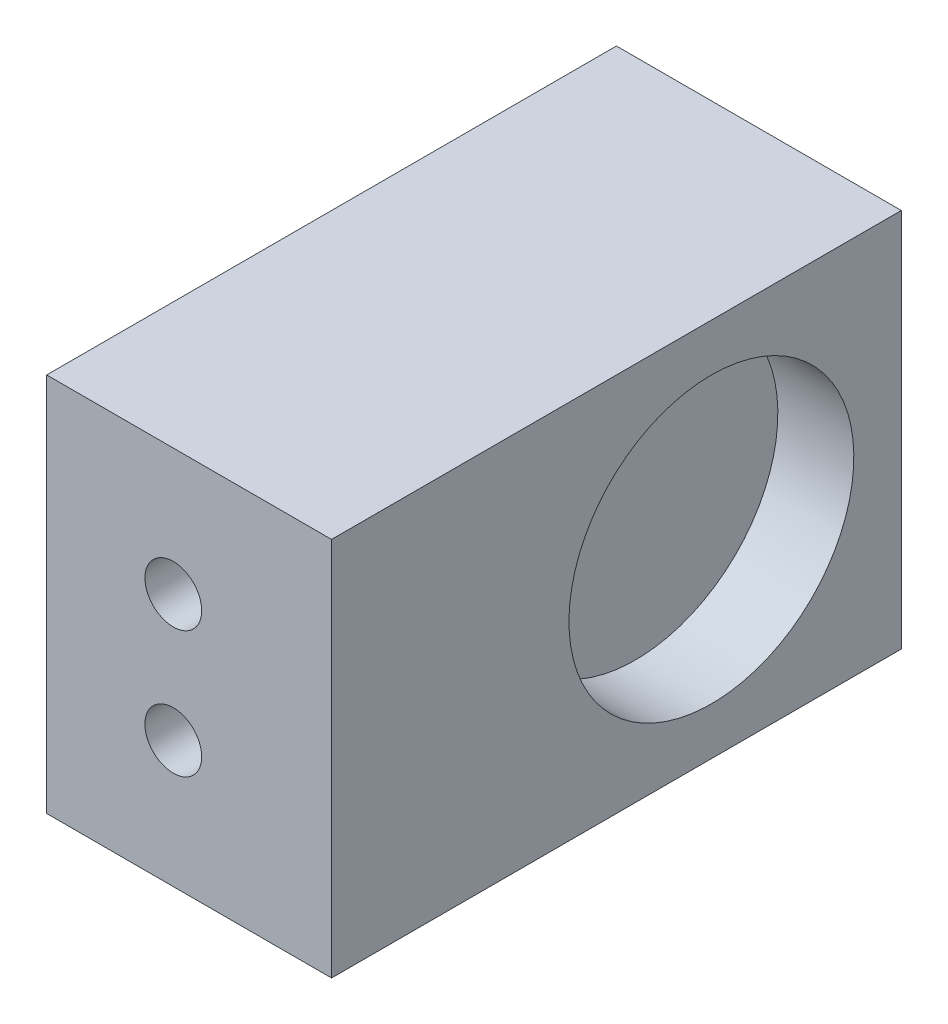
ISO-10303-21;
HEADER;
FILE_DESCRIPTION(('STEP AP214'),'2;1');
FILE_NAME('part.step','',(''),(''),'','','');
FILE_SCHEMA(('AUTOMOTIVE_DESIGN { 1 0 10303 214 1 1 1 1 }'));
ENDSEC;
DATA;
#1=APPLICATION_CONTEXT('core data for automotive mechanical design processes');
#2=APPLICATION_PROTOCOL_DEFINITION('international standard','automotive_design',2000,#1);
#3=PRODUCT_CONTEXT('',#1,'mechanical');
#4=PRODUCT('Part','Part','',(#3));
#5=PRODUCT_RELATED_PRODUCT_CATEGORY('part','',(#4));
#6=PRODUCT_DEFINITION_FORMATION('','',#4);
#7=PRODUCT_DEFINITION_CONTEXT('part definition',#1,'design');
#8=PRODUCT_DEFINITION('design','',#6,#7);
#9=PRODUCT_DEFINITION_SHAPE('','',#8);
#10=(LENGTH_UNIT() NAMED_UNIT(*) SI_UNIT(.MILLI.,.METRE.));
#11=(NAMED_UNIT(*) PLANE_ANGLE_UNIT() SI_UNIT($,.RADIAN.));
#12=(NAMED_UNIT(*) SI_UNIT($,.STERADIAN.) SOLID_ANGLE_UNIT());
#13=UNCERTAINTY_MEASURE_WITH_UNIT(LENGTH_MEASURE(1.E-05),#10,'distance_accuracy_value','');
#14=(GEOMETRIC_REPRESENTATION_CONTEXT(3) GLOBAL_UNCERTAINTY_ASSIGNED_CONTEXT((#13)) GLOBAL_UNIT_ASSIGNED_CONTEXT((#10,
#11,#12)) REPRESENTATION_CONTEXT('',''));
#15=CARTESIAN_POINT('',(0.,0.,0.));
#16=DIRECTION('',(0.,0.,1.));
#17=DIRECTION('',(1.,0.,0.));
#18=AXIS2_PLACEMENT_3D('',#15,#16,#17);
#19=CARTESIAN_POINT('',(0.,0.,38.1));
#20=DIRECTION('',(-1.,0.,0.));
#21=DIRECTION('',(0.,-1.,0.));
#22=AXIS2_PLACEMENT_3D('',#19,#20,#21);
#23=PLANE('',#22);
#24=CARTESIAN_POINT('',(0.,12.7,12.7));
#25=DIRECTION('',(1.,0.,0.));
#26=DIRECTION('',(0.,1.,0.));
#27=AXIS2_PLACEMENT_3D('',#24,#25,#26);
#28=CIRCLE('',#27,9.525);
#29=CARTESIAN_POINT('',(0.,22.225,12.7));
#30=VERTEX_POINT('',#29);
#31=EDGE_CURVE('E176',#30,#30,#28,.T.);
#32=ORIENTED_EDGE('',*,*,#31,.F.);
#33=EDGE_LOOP('',(#32));
#34=FACE_BOUND('',#33,.T.);
#35=DIRECTION('',(0.,1.,0.));
#36=VECTOR('',#35,1.);
#37=CARTESIAN_POINT('',(0.,0.,0.));
#38=LINE('',#37,#36);
#39=CARTESIAN_POINT('',(0.,0.,0.));
#40=VERTEX_POINT('',#39);
#41=CARTESIAN_POINT('',(0.,25.4,0.));
#42=VERTEX_POINT('',#41);
#43=EDGE_CURVE('E121',#40,#42,#38,.T.);
#44=ORIENTED_EDGE('',*,*,#43,.T.);
#45=DIRECTION('',(0.,0.,-1.));
#46=VECTOR('',#45,1.);
#47=CARTESIAN_POINT('',(0.,25.4,38.1));
#48=LINE('',#47,#46);
#49=CARTESIAN_POINT('',(0.,25.4,38.1));
#50=VERTEX_POINT('',#49);
#51=EDGE_CURVE('E11',#50,#42,#48,.T.);
#52=ORIENTED_EDGE('',*,*,#51,.F.);
#53=DIRECTION('',(0.,1.,0.));
#54=VECTOR('',#53,1.);
#55=CARTESIAN_POINT('',(0.,0.,38.1));
#56=LINE('',#55,#54);
#57=CARTESIAN_POINT('',(0.,0.,38.1));
#58=VERTEX_POINT('',#57);
#59=EDGE_CURVE('E122',#58,#50,#56,.T.);
#60=ORIENTED_EDGE('',*,*,#59,.F.);
#61=DIRECTION('',(0.,0.,-1.));
#62=VECTOR('',#61,1.);
#63=CARTESIAN_POINT('',(0.,0.,38.1));
#64=LINE('',#63,#62);
#65=EDGE_CURVE('E132',#58,#40,#64,.T.);
#66=ORIENTED_EDGE('',*,*,#65,.T.);
#67=EDGE_LOOP('',(#44,#52,#60,#66));
#68=FACE_BOUND('',#67,.T.);
#69=ADVANCED_FACE('F39',(#34,#68),#23,.F.);
#70=CARTESIAN_POINT('',(0.,25.4,38.1));
#71=DIRECTION('',(0.,-1.,0.));
#72=DIRECTION('',(1.,0.,0.));
#73=AXIS2_PLACEMENT_3D('',#70,#71,#72);
#74=PLANE('',#73);
#75=DIRECTION('',(-1.,0.,0.));
#76=VECTOR('',#75,1.);
#77=CARTESIAN_POINT('',(0.,25.4,0.));
#78=LINE('',#77,#76);
#79=CARTESIAN_POINT('',(-19.05,25.4,0.));
#80=VERTEX_POINT('',#79);
#81=EDGE_CURVE('E136',#42,#80,#78,.T.);
#82=ORIENTED_EDGE('',*,*,#81,.T.);
#83=DIRECTION('',(0.,0.,-1.));
#84=VECTOR('',#83,1.);
#85=CARTESIAN_POINT('',(-19.05,25.4,38.1));
#86=LINE('',#85,#84);
#87=CARTESIAN_POINT('',(-19.05,25.4,38.1));
#88=VERTEX_POINT('',#87);
#89=EDGE_CURVE('E48',#88,#80,#86,.T.);
#90=ORIENTED_EDGE('',*,*,#89,.F.);
#91=DIRECTION('',(-1.,0.,0.));
#92=VECTOR('',#91,1.);
#93=CARTESIAN_POINT('',(0.,25.4,38.1));
#94=LINE('',#93,#92);
#95=EDGE_CURVE('E87',#50,#88,#94,.T.);
#96=ORIENTED_EDGE('',*,*,#95,.F.);
#97=ORIENTED_EDGE('',*,*,#51,.T.);
#98=EDGE_LOOP('',(#82,#90,#96,#97));
#99=FACE_BOUND('',#98,.T.);
#100=ADVANCED_FACE('F166',(#99),#74,.F.);
#101=CARTESIAN_POINT('',(-19.05,0.,38.1));
#102=DIRECTION('',(1.,0.,0.));
#103=DIRECTION('',(0.,0.,-1.));
#104=AXIS2_PLACEMENT_3D('',#101,#102,#103);
#105=PLANE('',#104);
#106=DIRECTION('',(0.,-1.,0.));
#107=VECTOR('',#106,1.);
#108=CARTESIAN_POINT('',(-19.05,0.,0.));
#109=LINE('',#108,#107);
#110=CARTESIAN_POINT('',(-19.05,0.,0.));
#111=VERTEX_POINT('',#110);
#112=EDGE_CURVE('E74',#80,#111,#109,.T.);
#113=ORIENTED_EDGE('',*,*,#112,.T.);
#114=DIRECTION('',(0.,0.,-1.));
#115=VECTOR('',#114,1.);
#116=CARTESIAN_POINT('',(-19.05,0.,38.1));
#117=LINE('',#116,#115);
#118=CARTESIAN_POINT('',(-19.05,0.,38.1));
#119=VERTEX_POINT('',#118);
#120=EDGE_CURVE('E145',#119,#111,#117,.T.);
#121=ORIENTED_EDGE('',*,*,#120,.F.);
#122=DIRECTION('',(0.,-1.,0.));
#123=VECTOR('',#122,1.);
#124=CARTESIAN_POINT('',(-19.05,0.,38.1));
#125=LINE('',#124,#123);
#126=EDGE_CURVE('E127',#88,#119,#125,.T.);
#127=ORIENTED_EDGE('',*,*,#126,.F.);
#128=ORIENTED_EDGE('',*,*,#89,.T.);
#129=EDGE_LOOP('',(#113,#121,#127,#128));
#130=FACE_BOUND('',#129,.T.);
#131=ADVANCED_FACE('F149',(#130),#105,.F.);
#132=CARTESIAN_POINT('',(0.,0.,38.1));
#133=DIRECTION('',(0.,1.,0.));
#134=DIRECTION('',(-1.,0.,0.));
#135=AXIS2_PLACEMENT_3D('',#132,#133,#134);
#136=PLANE('',#135);
#137=DIRECTION('',(1.,0.,0.));
#138=VECTOR('',#137,1.);
#139=CARTESIAN_POINT('',(0.,0.,0.));
#140=LINE('',#139,#138);
#141=EDGE_CURVE('E80',#111,#40,#140,.T.);
#142=ORIENTED_EDGE('',*,*,#141,.T.);
#143=ORIENTED_EDGE('',*,*,#65,.F.);
#144=DIRECTION('',(1.,0.,0.));
#145=VECTOR('',#144,1.);
#146=CARTESIAN_POINT('',(0.,0.,38.1));
#147=LINE('',#146,#145);
#148=EDGE_CURVE('E56',#119,#58,#147,.T.);
#149=ORIENTED_EDGE('',*,*,#148,.F.);
#150=ORIENTED_EDGE('',*,*,#120,.T.);
#151=EDGE_LOOP('',(#142,#143,#149,#150));
#152=FACE_BOUND('',#151,.T.);
#153=ADVANCED_FACE('F156',(#152),#136,.F.);
#154=CARTESIAN_POINT('',(0.,0.,38.1));
#155=DIRECTION('',(0.,0.,1.));
#156=DIRECTION('',(1.,0.,0.));
#157=AXIS2_PLACEMENT_3D('',#154,#155,#156);
#158=PLANE('',#157);
#159=CARTESIAN_POINT('',(-10.5833333333333,16.9333333333333,38.1));
#160=DIRECTION('',(0.,0.,1.));
#161=DIRECTION('',(1.,0.,0.));
#162=AXIS2_PLACEMENT_3D('',#159,#160,#161);
#163=CIRCLE('',#162,1.89864999999999);
#164=CARTESIAN_POINT('',(-8.68468333333335,16.9333333333333,38.1));
#165=VERTEX_POINT('',#164);
#166=EDGE_CURVE('E106',#165,#165,#163,.T.);
#167=ORIENTED_EDGE('',*,*,#166,.F.);
#168=EDGE_LOOP('',(#167));
#169=FACE_BOUND('',#168,.T.);
#170=CARTESIAN_POINT('',(-10.5833333333333,8.46666666666666,38.1));
#171=DIRECTION('',(0.,0.,1.));
#172=DIRECTION('',(1.,0.,0.));
#173=AXIS2_PLACEMENT_3D('',#170,#171,#172);
#174=CIRCLE('',#173,1.89864999999999);
#175=CARTESIAN_POINT('',(-8.68468333333335,8.46666666666666,38.1));
#176=VERTEX_POINT('',#175);
#177=EDGE_CURVE('E105',#176,#176,#174,.T.);
#178=ORIENTED_EDGE('',*,*,#177,.F.);
#179=EDGE_LOOP('',(#178));
#180=FACE_BOUND('',#179,.T.);
#181=ORIENTED_EDGE('',*,*,#59,.T.);
#182=ORIENTED_EDGE('',*,*,#95,.T.);
#183=ORIENTED_EDGE('',*,*,#126,.T.);
#184=ORIENTED_EDGE('',*,*,#148,.T.);
#185=EDGE_LOOP('',(#181,#182,#183,#184));
#186=FACE_BOUND('',#185,.T.);
#187=ADVANCED_FACE('F158',(#169,#180,#186),#158,.T.);
#188=CARTESIAN_POINT('',(0.,0.,0.));
#189=DIRECTION('',(0.,0.,1.));
#190=DIRECTION('',(1.,0.,0.));
#191=AXIS2_PLACEMENT_3D('',#188,#189,#190);
#192=PLANE('',#191);
#193=ORIENTED_EDGE('',*,*,#43,.F.);
#194=ORIENTED_EDGE('',*,*,#141,.F.);
#195=ORIENTED_EDGE('',*,*,#112,.F.);
#196=ORIENTED_EDGE('',*,*,#81,.F.);
#197=EDGE_LOOP('',(#193,#194,#195,#196));
#198=FACE_BOUND('',#197,.T.);
#199=ADVANCED_FACE('F152',(#198),#192,.F.);
#200=CARTESIAN_POINT('',(-10.5833333333333,8.46666666666666,19.05));
#201=DIRECTION('',(0.,0.,1.));
#202=DIRECTION('',(1.,0.,0.));
#203=AXIS2_PLACEMENT_3D('',#200,#201,#202);
#204=CONICAL_SURFACE('',#203,1.89864999999999,1.02974425867665);
#205=CARTESIAN_POINT('',(-10.5833333333333,8.46666666666666,17.9091759856833));
#206=VERTEX_POINT('',#205);
#207=VERTEX_LOOP('',#206);
#208=FACE_BOUND('',#207,.T.);
#209=CARTESIAN_POINT('',(-10.5833333333333,8.46666666666666,19.05));
#210=DIRECTION('',(0.,0.,1.));
#211=DIRECTION('',(1.,0.,0.));
#212=AXIS2_PLACEMENT_3D('',#209,#210,#211);
#213=CIRCLE('',#212,1.89864999999999);
#214=CARTESIAN_POINT('',(-8.68468333333334,8.46666666666666,19.05));
#215=VERTEX_POINT('',#214);
#216=EDGE_CURVE('E111',#215,#215,#213,.T.);
#217=ORIENTED_EDGE('',*,*,#216,.T.);
#218=EDGE_LOOP('',(#217));
#219=FACE_BOUND('',#218,.T.);
#220=ADVANCED_FACE('F198',(#208,#219),#204,.F.);
#221=CARTESIAN_POINT('',(-10.5833333333333,8.46666666666666,38.1));
#222=DIRECTION('',(0.,0.,1.));
#223=DIRECTION('',(1.,0.,0.));
#224=AXIS2_PLACEMENT_3D('',#221,#222,#223);
#225=CYLINDRICAL_SURFACE('',#224,1.89864999999999);
#226=ORIENTED_EDGE('',*,*,#216,.F.);
#227=EDGE_LOOP('',(#226));
#228=FACE_BOUND('',#227,.T.);
#229=ORIENTED_EDGE('',*,*,#177,.T.);
#230=EDGE_LOOP('',(#229));
#231=FACE_BOUND('',#230,.T.);
#232=ADVANCED_FACE('F98',(#228,#231),#225,.F.);
#233=CARTESIAN_POINT('',(-10.5833333333333,16.9333333333333,19.05));
#234=DIRECTION('',(0.,0.,1.));
#235=DIRECTION('',(1.,0.,0.));
#236=AXIS2_PLACEMENT_3D('',#233,#234,#235);
#237=CONICAL_SURFACE('',#236,1.89864999999999,1.02974425867665);
#238=CARTESIAN_POINT('',(-10.5833333333333,16.9333333333333,17.9091759856833));
#239=VERTEX_POINT('',#238);
#240=VERTEX_LOOP('',#239);
#241=FACE_BOUND('',#240,.T.);
#242=CARTESIAN_POINT('',(-10.5833333333333,16.9333333333333,19.05));
#243=DIRECTION('',(0.,0.,1.));
#244=DIRECTION('',(1.,0.,0.));
#245=AXIS2_PLACEMENT_3D('',#242,#243,#244);
#246=CIRCLE('',#245,1.89864999999999);
#247=CARTESIAN_POINT('',(-8.68468333333334,16.9333333333333,19.05));
#248=VERTEX_POINT('',#247);
#249=EDGE_CURVE('E102',#248,#248,#246,.T.);
#250=ORIENTED_EDGE('',*,*,#249,.T.);
#251=EDGE_LOOP('',(#250));
#252=FACE_BOUND('',#251,.T.);
#253=ADVANCED_FACE('F94',(#241,#252),#237,.F.);
#254=CARTESIAN_POINT('',(-10.5833333333333,16.9333333333333,38.1));
#255=DIRECTION('',(0.,0.,1.));
#256=DIRECTION('',(1.,0.,0.));
#257=AXIS2_PLACEMENT_3D('',#254,#255,#256);
#258=CYLINDRICAL_SURFACE('',#257,1.89864999999999);
#259=ORIENTED_EDGE('',*,*,#249,.F.);
#260=EDGE_LOOP('',(#259));
#261=FACE_BOUND('',#260,.T.);
#262=ORIENTED_EDGE('',*,*,#166,.T.);
#263=EDGE_LOOP('',(#262));
#264=FACE_BOUND('',#263,.T.);
#265=ADVANCED_FACE('F97',(#261,#264),#258,.F.);
#266=CARTESIAN_POINT('',(-5.08,12.7,12.7));
#267=DIRECTION('',(1.,0.,0.));
#268=DIRECTION('',(0.,1.,0.));
#269=AXIS2_PLACEMENT_3D('',#266,#267,#268);
#270=CYLINDRICAL_SURFACE('',#269,9.525);
#271=CARTESIAN_POINT('',(-5.08,12.7,12.7));
#272=DIRECTION('',(1.,0.,0.));
#273=DIRECTION('',(0.,1.,0.));
#274=AXIS2_PLACEMENT_3D('',#271,#272,#273);
#275=CIRCLE('',#274,9.525);
#276=CARTESIAN_POINT('',(-5.08,22.225,12.7));
#277=VERTEX_POINT('',#276);
#278=EDGE_CURVE('E114',#277,#277,#275,.T.);
#279=ORIENTED_EDGE('',*,*,#278,.F.);
#280=EDGE_LOOP('',(#279));
#281=FACE_BOUND('',#280,.T.);
#282=ORIENTED_EDGE('',*,*,#31,.T.);
#283=EDGE_LOOP('',(#282));
#284=FACE_BOUND('',#283,.T.);
#285=ADVANCED_FACE('F186',(#281,#284),#270,.F.);
#286=CARTESIAN_POINT('',(-5.08,12.7,12.7));
#287=DIRECTION('',(1.,0.,0.));
#288=DIRECTION('',(0.,1.,0.));
#289=AXIS2_PLACEMENT_3D('',#286,#287,#288);
#290=PLANE('',#289);
#291=ORIENTED_EDGE('',*,*,#278,.T.);
#292=EDGE_LOOP('',(#291));
#293=FACE_BOUND('',#292,.T.);
#294=ADVANCED_FACE('F184',(#293),#290,.T.);
#295=CLOSED_SHELL('',(#69,#100,#131,#153,#187,#199,#220,#232,#253,#265,#285,#294));
#296=MANIFOLD_SOLID_BREP('B2',#295);
#297=ADVANCED_BREP_SHAPE_REPRESENTATION('',(#18,#296),#14);
#298=SHAPE_DEFINITION_REPRESENTATION(#9,#297);
ENDSEC;
END-ISO-10303-21;
